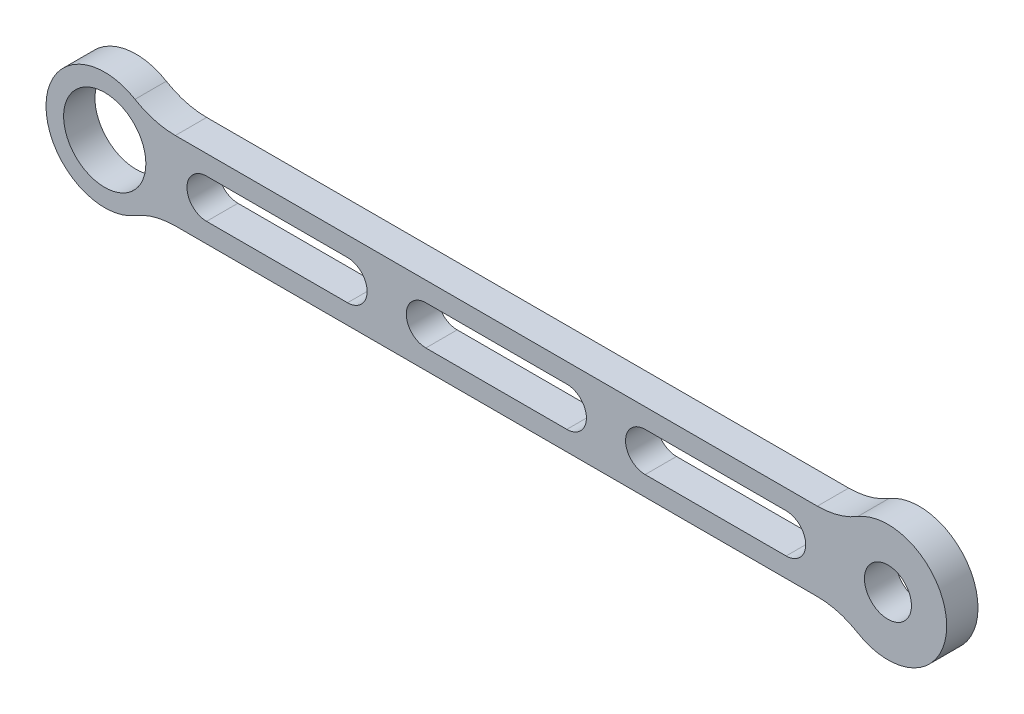
ISO-10303-21;
HEADER;
FILE_DESCRIPTION(('STEP AP214'),'2;1');
FILE_NAME('part.step','',(''),(''),'','','');
FILE_SCHEMA(('AUTOMOTIVE_DESIGN { 1 0 10303 214 1 1 1 1 }'));
ENDSEC;
DATA;
#1=APPLICATION_CONTEXT('core data for automotive mechanical design processes');
#2=APPLICATION_PROTOCOL_DEFINITION('international standard','automotive_design',2000,#1);
#3=PRODUCT_CONTEXT('',#1,'mechanical');
#4=PRODUCT('Part','Part','',(#3));
#5=PRODUCT_RELATED_PRODUCT_CATEGORY('part','',(#4));
#6=PRODUCT_DEFINITION_FORMATION('','',#4);
#7=PRODUCT_DEFINITION_CONTEXT('part definition',#1,'design');
#8=PRODUCT_DEFINITION('design','',#6,#7);
#9=PRODUCT_DEFINITION_SHAPE('','',#8);
#10=(LENGTH_UNIT() NAMED_UNIT(*) SI_UNIT(.MILLI.,.METRE.));
#11=(NAMED_UNIT(*) PLANE_ANGLE_UNIT() SI_UNIT($,.RADIAN.));
#12=(NAMED_UNIT(*) SI_UNIT($,.STERADIAN.) SOLID_ANGLE_UNIT());
#13=UNCERTAINTY_MEASURE_WITH_UNIT(LENGTH_MEASURE(1.E-05),#10,'distance_accuracy_value','');
#14=(GEOMETRIC_REPRESENTATION_CONTEXT(3) GLOBAL_UNCERTAINTY_ASSIGNED_CONTEXT((#13)) GLOBAL_UNIT_ASSIGNED_CONTEXT((#10,
#11,#12)) REPRESENTATION_CONTEXT('',''));
#15=CARTESIAN_POINT('',(0.,0.,0.));
#16=DIRECTION('',(0.,0.,1.));
#17=DIRECTION('',(1.,0.,0.));
#18=AXIS2_PLACEMENT_3D('',#15,#16,#17);
#19=CARTESIAN_POINT('',(0.,0.,8.));
#20=DIRECTION('',(0.,0.,-1.));
#21=DIRECTION('',(-1.,0.,0.));
#22=AXIS2_PLACEMENT_3D('',#19,#20,#21);
#23=CYLINDRICAL_SURFACE('',#22,15.);
#24=CARTESIAN_POINT('',(0.,0.,0.));
#25=DIRECTION('',(0.,0.,1.));
#26=DIRECTION('',(1.,0.,0.));
#27=AXIS2_PLACEMENT_3D('',#24,#25,#26);
#28=CIRCLE('',#27,15.);
#29=CARTESIAN_POINT('',(7.72618130456569,12.8571428571429,0.));
#30=VERTEX_POINT('',#29);
#31=CARTESIAN_POINT('',(7.72618130456569,-12.8571428571429,0.));
#32=VERTEX_POINT('',#31);
#33=EDGE_CURVE('E265',#30,#32,#28,.T.);
#34=ORIENTED_EDGE('',*,*,#33,.T.);
#35=DIRECTION('',(0.,0.,-1.));
#36=VECTOR('',#35,1.);
#37=CARTESIAN_POINT('',(7.7261813045657,-12.8571428571429,8.));
#38=LINE('',#37,#36);
#39=CARTESIAN_POINT('',(7.72618130456569,-12.8571428571429,8.));
#40=VERTEX_POINT('',#39);
#41=EDGE_CURVE('E294',#32,#40,#38,.F.);
#42=ORIENTED_EDGE('',*,*,#41,.T.);
#43=CARTESIAN_POINT('',(0.,0.,8.));
#44=DIRECTION('',(0.,0.,1.));
#45=DIRECTION('',(1.,0.,0.));
#46=AXIS2_PLACEMENT_3D('',#43,#44,#45);
#47=CIRCLE('',#46,15.);
#48=CARTESIAN_POINT('',(7.72618130456569,12.8571428571429,8.));
#49=VERTEX_POINT('',#48);
#50=EDGE_CURVE('E251',#49,#40,#47,.T.);
#51=ORIENTED_EDGE('',*,*,#50,.F.);
#52=DIRECTION('',(0.,0.,-1.));
#53=VECTOR('',#52,1.);
#54=CARTESIAN_POINT('',(7.7261813045657,12.8571428571429,8.));
#55=LINE('',#54,#53);
#56=EDGE_CURVE('E291',#49,#30,#55,.T.);
#57=ORIENTED_EDGE('',*,*,#56,.T.);
#58=EDGE_LOOP('',(#34,#42,#51,#57));
#59=FACE_BOUND('',#58,.T.);
#60=ADVANCED_FACE('F36',(#59),#23,.T.);
#61=CARTESIAN_POINT('',(0.,-10.,8.));
#62=DIRECTION('',(0.,1.,0.));
#63=DIRECTION('',(0.,0.,1.));
#64=AXIS2_PLACEMENT_3D('',#61,#62,#63);
#65=PLANE('',#64);
#66=DIRECTION('',(1.,0.,0.));
#67=VECTOR('',#66,1.);
#68=CARTESIAN_POINT('',(0.,-10.,0.));
#69=LINE('',#68,#67);
#70=CARTESIAN_POINT('',(18.02775637732,-10.,0.));
#71=VERTEX_POINT('',#70);
#72=CARTESIAN_POINT('',(181.97224362268,-10.,0.));
#73=VERTEX_POINT('',#72);
#74=EDGE_CURVE('E268',#71,#73,#69,.T.);
#75=ORIENTED_EDGE('',*,*,#74,.T.);
#76=DIRECTION('',(0.,0.,1.));
#77=VECTOR('',#76,1.);
#78=CARTESIAN_POINT('',(181.97224362268,-10.,8.));
#79=LINE('',#78,#77);
#80=CARTESIAN_POINT('',(181.97224362268,-10.,8.));
#81=VERTEX_POINT('',#80);
#82=EDGE_CURVE('E289',#73,#81,#79,.T.);
#83=ORIENTED_EDGE('',*,*,#82,.T.);
#84=DIRECTION('',(1.,0.,0.));
#85=VECTOR('',#84,1.);
#86=CARTESIAN_POINT('',(0.,-10.,8.));
#87=LINE('',#86,#85);
#88=CARTESIAN_POINT('',(18.02775637732,-10.,8.));
#89=VERTEX_POINT('',#88);
#90=EDGE_CURVE('E254',#89,#81,#87,.T.);
#91=ORIENTED_EDGE('',*,*,#90,.F.);
#92=DIRECTION('',(0.,0.,1.));
#93=VECTOR('',#92,1.);
#94=CARTESIAN_POINT('',(18.02775637732,-10.,0.));
#95=LINE('',#94,#93);
#96=EDGE_CURVE('E286',#89,#71,#95,.F.);
#97=ORIENTED_EDGE('',*,*,#96,.T.);
#98=EDGE_LOOP('',(#75,#83,#91,#97));
#99=FACE_BOUND('',#98,.T.);
#100=ADVANCED_FACE('F362',(#99),#65,.F.);
#101=CARTESIAN_POINT('',(200.,0.,8.));
#102=DIRECTION('',(0.,0.,-1.));
#103=DIRECTION('',(-1.,0.,0.));
#104=AXIS2_PLACEMENT_3D('',#101,#102,#103);
#105=CYLINDRICAL_SURFACE('',#104,15.);
#106=CARTESIAN_POINT('',(200.,0.,0.));
#107=DIRECTION('',(0.,0.,1.));
#108=DIRECTION('',(1.,0.,0.));
#109=AXIS2_PLACEMENT_3D('',#106,#107,#108);
#110=CIRCLE('',#109,15.);
#111=CARTESIAN_POINT('',(192.273818695434,-12.8571428571429,0.));
#112=VERTEX_POINT('',#111);
#113=CARTESIAN_POINT('',(192.273818695434,12.8571428571429,0.));
#114=VERTEX_POINT('',#113);
#115=EDGE_CURVE('E272',#112,#114,#110,.T.);
#116=ORIENTED_EDGE('',*,*,#115,.T.);
#117=DIRECTION('',(0.,0.,-1.));
#118=VECTOR('',#117,1.);
#119=CARTESIAN_POINT('',(192.273818695434,12.8571428571429,8.));
#120=LINE('',#119,#118);
#121=CARTESIAN_POINT('',(192.273818695434,12.8571428571429,8.));
#122=VERTEX_POINT('',#121);
#123=EDGE_CURVE('E284',#114,#122,#120,.F.);
#124=ORIENTED_EDGE('',*,*,#123,.T.);
#125=CARTESIAN_POINT('',(200.,0.,8.));
#126=DIRECTION('',(0.,0.,1.));
#127=DIRECTION('',(1.,0.,0.));
#128=AXIS2_PLACEMENT_3D('',#125,#126,#127);
#129=CIRCLE('',#128,15.);
#130=CARTESIAN_POINT('',(192.273818695434,-12.8571428571429,8.));
#131=VERTEX_POINT('',#130);
#132=EDGE_CURVE('E258',#131,#122,#129,.T.);
#133=ORIENTED_EDGE('',*,*,#132,.F.);
#134=DIRECTION('',(0.,0.,-1.));
#135=VECTOR('',#134,1.);
#136=CARTESIAN_POINT('',(192.273818695434,-12.8571428571429,8.));
#137=LINE('',#136,#135);
#138=EDGE_CURVE('E281',#131,#112,#137,.T.);
#139=ORIENTED_EDGE('',*,*,#138,.T.);
#140=EDGE_LOOP('',(#116,#124,#133,#139));
#141=FACE_BOUND('',#140,.T.);
#142=ADVANCED_FACE('F368',(#141),#105,.T.);
#143=CARTESIAN_POINT('',(0.,10.,8.));
#144=DIRECTION('',(0.,1.,0.));
#145=DIRECTION('',(0.,0.,1.));
#146=AXIS2_PLACEMENT_3D('',#143,#144,#145);
#147=PLANE('',#146);
#148=DIRECTION('',(1.,0.,0.));
#149=VECTOR('',#148,1.);
#150=CARTESIAN_POINT('',(0.,10.,8.));
#151=LINE('',#150,#149);
#152=CARTESIAN_POINT('',(18.02775637732,10.,8.));
#153=VERTEX_POINT('',#152);
#154=CARTESIAN_POINT('',(181.97224362268,10.,8.));
#155=VERTEX_POINT('',#154);
#156=EDGE_CURVE('E261',#153,#155,#151,.T.);
#157=ORIENTED_EDGE('',*,*,#156,.T.);
#158=DIRECTION('',(0.,0.,-1.));
#159=VECTOR('',#158,1.);
#160=CARTESIAN_POINT('',(181.97224362268,10.,8.));
#161=LINE('',#160,#159);
#162=CARTESIAN_POINT('',(181.97224362268,10.,0.));
#163=VERTEX_POINT('',#162);
#164=EDGE_CURVE('E278',#155,#163,#161,.T.);
#165=ORIENTED_EDGE('',*,*,#164,.T.);
#166=DIRECTION('',(1.,0.,0.));
#167=VECTOR('',#166,1.);
#168=CARTESIAN_POINT('',(0.,10.,0.));
#169=LINE('',#168,#167);
#170=CARTESIAN_POINT('',(18.02775637732,10.,0.));
#171=VERTEX_POINT('',#170);
#172=EDGE_CURVE('E255',#171,#163,#169,.T.);
#173=ORIENTED_EDGE('',*,*,#172,.F.);
#174=DIRECTION('',(0.,0.,-1.));
#175=VECTOR('',#174,1.);
#176=CARTESIAN_POINT('',(18.02775637732,10.,8.));
#177=LINE('',#176,#175);
#178=EDGE_CURVE('E264',#171,#153,#177,.F.);
#179=ORIENTED_EDGE('',*,*,#178,.T.);
#180=EDGE_LOOP('',(#157,#165,#173,#179));
#181=FACE_BOUND('',#180,.T.);
#182=ADVANCED_FACE('F407',(#181),#147,.T.);
#183=CARTESIAN_POINT('',(0.,0.,8.));
#184=DIRECTION('',(0.,0.,1.));
#185=DIRECTION('',(1.,0.,0.));
#186=AXIS2_PLACEMENT_3D('',#183,#184,#185);
#187=PLANE('',#186);
#188=DIRECTION('',(1.,0.,0.));
#189=VECTOR('',#188,1.);
#190=CARTESIAN_POINT('',(0.,-5.00000000000039,8.));
#191=LINE('',#190,#189);
#192=CARTESIAN_POINT('',(26.,-5.00000000000039,8.));
#193=VERTEX_POINT('',#192);
#194=CARTESIAN_POINT('',(62.,-5.0000000000004,8.));
#195=VERTEX_POINT('',#194);
#196=EDGE_CURVE('E51',#193,#195,#191,.T.);
#197=ORIENTED_EDGE('',*,*,#196,.F.);
#198=CARTESIAN_POINT('',(26.,-3.87576462998477E-13,8.));
#199=DIRECTION('',(0.,0.,1.));
#200=DIRECTION('',(1.,0.,0.));
#201=AXIS2_PLACEMENT_3D('',#198,#199,#200);
#202=CIRCLE('',#201,5.);
#203=CARTESIAN_POINT('',(26.,4.99999999999961,8.));
#204=VERTEX_POINT('',#203);
#205=EDGE_CURVE('E197',#204,#193,#202,.T.);
#206=ORIENTED_EDGE('',*,*,#205,.F.);
#207=DIRECTION('',(1.,0.,0.));
#208=VECTOR('',#207,1.);
#209=CARTESIAN_POINT('',(0.,4.99999999999962,8.));
#210=LINE('',#209,#208);
#211=CARTESIAN_POINT('',(62.,4.99999999999961,8.));
#212=VERTEX_POINT('',#211);
#213=EDGE_CURVE('E180',#204,#212,#210,.T.);
#214=ORIENTED_EDGE('',*,*,#213,.T.);
#215=CARTESIAN_POINT('',(62.,-3.85841739522501E-13,8.));
#216=DIRECTION('',(0.,0.,1.));
#217=DIRECTION('',(1.,0.,0.));
#218=AXIS2_PLACEMENT_3D('',#215,#216,#217);
#219=CIRCLE('',#218,5.00000000000001);
#220=EDGE_CURVE('E190',#195,#212,#219,.T.);
#221=ORIENTED_EDGE('',*,*,#220,.F.);
#222=EDGE_LOOP('',(#197,#206,#214,#221));
#223=FACE_BOUND('',#222,.T.);
#224=CARTESIAN_POINT('',(82.,0.,8.));
#225=DIRECTION('',(0.,0.,1.));
#226=DIRECTION('',(1.,0.,0.));
#227=AXIS2_PLACEMENT_3D('',#224,#225,#226);
#228=CIRCLE('',#227,5.);
#229=CARTESIAN_POINT('',(82.,5.,8.));
#230=VERTEX_POINT('',#229);
#231=CARTESIAN_POINT('',(82.,-5.,8.));
#232=VERTEX_POINT('',#231);
#233=EDGE_CURVE('E59',#230,#232,#228,.T.);
#234=ORIENTED_EDGE('',*,*,#233,.F.);
#235=DIRECTION('',(1.,0.,0.));
#236=VECTOR('',#235,1.);
#237=CARTESIAN_POINT('',(0.,5.00000000000001,8.));
#238=LINE('',#237,#236);
#239=CARTESIAN_POINT('',(118.,5.,8.));
#240=VERTEX_POINT('',#239);
#241=EDGE_CURVE('E215',#230,#240,#238,.T.);
#242=ORIENTED_EDGE('',*,*,#241,.T.);
#243=CARTESIAN_POINT('',(118.,0.,8.));
#244=DIRECTION('',(0.,0.,1.));
#245=DIRECTION('',(1.,0.,0.));
#246=AXIS2_PLACEMENT_3D('',#243,#244,#245);
#247=CIRCLE('',#246,5.);
#248=CARTESIAN_POINT('',(118.,-4.99999999999999,8.));
#249=VERTEX_POINT('',#248);
#250=EDGE_CURVE('E212',#249,#240,#247,.T.);
#251=ORIENTED_EDGE('',*,*,#250,.F.);
#252=DIRECTION('',(1.,0.,0.));
#253=VECTOR('',#252,1.);
#254=CARTESIAN_POINT('',(0.,-5.00000000000001,8.));
#255=LINE('',#254,#253);
#256=EDGE_CURVE('E208',#232,#249,#255,.T.);
#257=ORIENTED_EDGE('',*,*,#256,.F.);
#258=EDGE_LOOP('',(#234,#242,#251,#257));
#259=FACE_BOUND('',#258,.T.);
#260=CARTESIAN_POINT('',(138.,0.,8.));
#261=DIRECTION('',(0.,0.,1.));
#262=DIRECTION('',(1.,0.,0.));
#263=AXIS2_PLACEMENT_3D('',#260,#261,#262);
#264=CIRCLE('',#263,4.99999999999999);
#265=CARTESIAN_POINT('',(138.,5.,8.));
#266=VERTEX_POINT('',#265);
#267=CARTESIAN_POINT('',(138.,-5.,8.));
#268=VERTEX_POINT('',#267);
#269=EDGE_CURVE('E226',#266,#268,#264,.T.);
#270=ORIENTED_EDGE('',*,*,#269,.F.);
#271=DIRECTION('',(1.,0.,0.));
#272=VECTOR('',#271,1.);
#273=CARTESIAN_POINT('',(0.,5.00000000000002,8.));
#274=LINE('',#273,#272);
#275=CARTESIAN_POINT('',(174.,5.,8.));
#276=VERTEX_POINT('',#275);
#277=EDGE_CURVE('E234',#266,#276,#274,.T.);
#278=ORIENTED_EDGE('',*,*,#277,.T.);
#279=CARTESIAN_POINT('',(174.,0.,8.));
#280=DIRECTION('',(0.,0.,1.));
#281=DIRECTION('',(1.,0.,0.));
#282=AXIS2_PLACEMENT_3D('',#279,#280,#281);
#283=CIRCLE('',#282,4.99999999999999);
#284=CARTESIAN_POINT('',(174.,-4.99999999999999,8.));
#285=VERTEX_POINT('',#284);
#286=EDGE_CURVE('E231',#285,#276,#283,.T.);
#287=ORIENTED_EDGE('',*,*,#286,.F.);
#288=DIRECTION('',(1.,0.,0.));
#289=VECTOR('',#288,1.);
#290=CARTESIAN_POINT('',(0.,-5.00000000000002,8.));
#291=LINE('',#290,#289);
#292=EDGE_CURVE('E228',#268,#285,#291,.T.);
#293=ORIENTED_EDGE('',*,*,#292,.F.);
#294=EDGE_LOOP('',(#270,#278,#287,#293));
#295=FACE_BOUND('',#294,.T.);
#296=CARTESIAN_POINT('',(0.,0.,8.));
#297=DIRECTION('',(0.,0.,1.));
#298=DIRECTION('',(1.,0.,0.));
#299=AXIS2_PLACEMENT_3D('',#296,#297,#298);
#300=CIRCLE('',#299,10.5);
#301=CARTESIAN_POINT('',(10.5,0.,8.));
#302=VERTEX_POINT('',#301);
#303=EDGE_CURVE('E245',#302,#302,#300,.T.);
#304=ORIENTED_EDGE('',*,*,#303,.F.);
#305=EDGE_LOOP('',(#304));
#306=FACE_BOUND('',#305,.T.);
#307=CARTESIAN_POINT('',(200.,0.,8.));
#308=DIRECTION('',(0.,0.,1.));
#309=DIRECTION('',(1.,0.,0.));
#310=AXIS2_PLACEMENT_3D('',#307,#308,#309);
#311=CIRCLE('',#310,6.00000000000002);
#312=CARTESIAN_POINT('',(206.,0.,8.));
#313=VERTEX_POINT('',#312);
#314=EDGE_CURVE('E204',#313,#313,#311,.T.);
#315=ORIENTED_EDGE('',*,*,#314,.F.);
#316=EDGE_LOOP('',(#315));
#317=FACE_BOUND('',#316,.T.);
#318=ORIENTED_EDGE('',*,*,#156,.F.);
#319=CARTESIAN_POINT('',(18.02775637732,30.,8.));
#320=DIRECTION('',(0.,0.,1.));
#321=DIRECTION('',(1.,0.,0.));
#322=AXIS2_PLACEMENT_3D('',#319,#320,#321);
#323=CIRCLE('',#322,20.);
#324=EDGE_CURVE('E310',#153,#49,#323,.F.);
#325=ORIENTED_EDGE('',*,*,#324,.T.);
#326=ORIENTED_EDGE('',*,*,#50,.T.);
#327=CARTESIAN_POINT('',(18.02775637732,-30.,8.));
#328=DIRECTION('',(0.,0.,1.));
#329=DIRECTION('',(1.,0.,0.));
#330=AXIS2_PLACEMENT_3D('',#327,#328,#329);
#331=CIRCLE('',#330,20.);
#332=EDGE_CURVE('E306',#40,#89,#331,.F.);
#333=ORIENTED_EDGE('',*,*,#332,.T.);
#334=ORIENTED_EDGE('',*,*,#90,.T.);
#335=CARTESIAN_POINT('',(181.97224362268,-30.,8.));
#336=DIRECTION('',(0.,0.,1.));
#337=DIRECTION('',(1.,0.,0.));
#338=AXIS2_PLACEMENT_3D('',#335,#336,#337);
#339=CIRCLE('',#338,20.);
#340=EDGE_CURVE('E302',#81,#131,#339,.F.);
#341=ORIENTED_EDGE('',*,*,#340,.T.);
#342=ORIENTED_EDGE('',*,*,#132,.T.);
#343=CARTESIAN_POINT('',(181.97224362268,30.,8.));
#344=DIRECTION('',(0.,0.,1.));
#345=DIRECTION('',(1.,0.,0.));
#346=AXIS2_PLACEMENT_3D('',#343,#344,#345);
#347=CIRCLE('',#346,20.);
#348=EDGE_CURVE('E298',#122,#155,#347,.F.);
#349=ORIENTED_EDGE('',*,*,#348,.T.);
#350=EDGE_LOOP('',(#318,#325,#326,#333,#334,#341,#342,#349));
#351=FACE_BOUND('',#350,.T.);
#352=ADVANCED_FACE('F194',(#223,#259,#295,#306,#317,#351),#187,.T.);
#353=CARTESIAN_POINT('',(0.,0.,0.));
#354=DIRECTION('',(0.,0.,1.));
#355=DIRECTION('',(1.,0.,0.));
#356=AXIS2_PLACEMENT_3D('',#353,#354,#355);
#357=PLANE('',#356);
#358=CARTESIAN_POINT('',(26.,-3.87576462998477E-13,0.));
#359=DIRECTION('',(0.,0.,1.));
#360=DIRECTION('',(1.,0.,0.));
#361=AXIS2_PLACEMENT_3D('',#358,#359,#360);
#362=CIRCLE('',#361,5.);
#363=CARTESIAN_POINT('',(26.,4.99999999999961,0.));
#364=VERTEX_POINT('',#363);
#365=CARTESIAN_POINT('',(26.,-5.00000000000039,0.));
#366=VERTEX_POINT('',#365);
#367=EDGE_CURVE('E44',#364,#366,#362,.T.);
#368=ORIENTED_EDGE('',*,*,#367,.T.);
#369=DIRECTION('',(1.,0.,0.));
#370=VECTOR('',#369,1.);
#371=CARTESIAN_POINT('',(0.,-5.00000000000039,0.));
#372=LINE('',#371,#370);
#373=CARTESIAN_POINT('',(62.,-5.00000000000038,0.));
#374=VERTEX_POINT('',#373);
#375=EDGE_CURVE('E11',#366,#374,#372,.T.);
#376=ORIENTED_EDGE('',*,*,#375,.T.);
#377=CARTESIAN_POINT('',(62.,-3.85841739522501E-13,0.));
#378=DIRECTION('',(0.,0.,1.));
#379=DIRECTION('',(1.,0.,0.));
#380=AXIS2_PLACEMENT_3D('',#377,#378,#379);
#381=CIRCLE('',#380,5.00000000000001);
#382=CARTESIAN_POINT('',(62.,4.99999999999962,0.));
#383=VERTEX_POINT('',#382);
#384=EDGE_CURVE('E338',#374,#383,#381,.T.);
#385=ORIENTED_EDGE('',*,*,#384,.T.);
#386=DIRECTION('',(1.,0.,0.));
#387=VECTOR('',#386,1.);
#388=CARTESIAN_POINT('',(0.,4.99999999999962,0.));
#389=LINE('',#388,#387);
#390=EDGE_CURVE('E183',#364,#383,#389,.T.);
#391=ORIENTED_EDGE('',*,*,#390,.F.);
#392=EDGE_LOOP('',(#368,#376,#385,#391));
#393=FACE_BOUND('',#392,.T.);
#394=DIRECTION('',(1.,0.,0.));
#395=VECTOR('',#394,1.);
#396=CARTESIAN_POINT('',(0.,5.00000000000001,0.));
#397=LINE('',#396,#395);
#398=CARTESIAN_POINT('',(82.,5.,0.));
#399=VERTEX_POINT('',#398);
#400=CARTESIAN_POINT('',(118.,5.,0.));
#401=VERTEX_POINT('',#400);
#402=EDGE_CURVE('E333',#399,#401,#397,.T.);
#403=ORIENTED_EDGE('',*,*,#402,.F.);
#404=CARTESIAN_POINT('',(82.,0.,0.));
#405=DIRECTION('',(0.,0.,1.));
#406=DIRECTION('',(1.,0.,0.));
#407=AXIS2_PLACEMENT_3D('',#404,#405,#406);
#408=CIRCLE('',#407,5.);
#409=CARTESIAN_POINT('',(82.,-5.,0.));
#410=VERTEX_POINT('',#409);
#411=EDGE_CURVE('E335',#399,#410,#408,.T.);
#412=ORIENTED_EDGE('',*,*,#411,.T.);
#413=DIRECTION('',(1.,0.,0.));
#414=VECTOR('',#413,1.);
#415=CARTESIAN_POINT('',(0.,-5.00000000000001,0.));
#416=LINE('',#415,#414);
#417=CARTESIAN_POINT('',(118.,-4.99999999999999,0.));
#418=VERTEX_POINT('',#417);
#419=EDGE_CURVE('E327',#410,#418,#416,.T.);
#420=ORIENTED_EDGE('',*,*,#419,.T.);
#421=CARTESIAN_POINT('',(118.,0.,0.));
#422=DIRECTION('',(0.,0.,1.));
#423=DIRECTION('',(1.,0.,0.));
#424=AXIS2_PLACEMENT_3D('',#421,#422,#423);
#425=CIRCLE('',#424,5.);
#426=EDGE_CURVE('E330',#418,#401,#425,.T.);
#427=ORIENTED_EDGE('',*,*,#426,.T.);
#428=EDGE_LOOP('',(#403,#412,#420,#427));
#429=FACE_BOUND('',#428,.T.);
#430=DIRECTION('',(1.,0.,0.));
#431=VECTOR('',#430,1.);
#432=CARTESIAN_POINT('',(0.,5.00000000000002,0.));
#433=LINE('',#432,#431);
#434=CARTESIAN_POINT('',(138.,5.,0.));
#435=VERTEX_POINT('',#434);
#436=CARTESIAN_POINT('',(174.,5.,0.));
#437=VERTEX_POINT('',#436);
#438=EDGE_CURVE('E322',#435,#437,#433,.T.);
#439=ORIENTED_EDGE('',*,*,#438,.F.);
#440=CARTESIAN_POINT('',(138.,0.,0.));
#441=DIRECTION('',(0.,0.,1.));
#442=DIRECTION('',(1.,0.,0.));
#443=AXIS2_PLACEMENT_3D('',#440,#441,#442);
#444=CIRCLE('',#443,4.99999999999999);
#445=CARTESIAN_POINT('',(138.,-5.,0.));
#446=VERTEX_POINT('',#445);
#447=EDGE_CURVE('E324',#435,#446,#444,.T.);
#448=ORIENTED_EDGE('',*,*,#447,.T.);
#449=DIRECTION('',(1.,0.,0.));
#450=VECTOR('',#449,1.);
#451=CARTESIAN_POINT('',(0.,-5.00000000000002,0.));
#452=LINE('',#451,#450);
#453=CARTESIAN_POINT('',(174.,-4.99999999999999,0.));
#454=VERTEX_POINT('',#453);
#455=EDGE_CURVE('E312',#446,#454,#452,.T.);
#456=ORIENTED_EDGE('',*,*,#455,.T.);
#457=CARTESIAN_POINT('',(174.,0.,0.));
#458=DIRECTION('',(0.,0.,1.));
#459=DIRECTION('',(1.,0.,0.));
#460=AXIS2_PLACEMENT_3D('',#457,#458,#459);
#461=CIRCLE('',#460,4.99999999999999);
#462=EDGE_CURVE('E319',#454,#437,#461,.T.);
#463=ORIENTED_EDGE('',*,*,#462,.T.);
#464=EDGE_LOOP('',(#439,#448,#456,#463));
#465=FACE_BOUND('',#464,.T.);
#466=CARTESIAN_POINT('',(0.,0.,0.));
#467=DIRECTION('',(0.,0.,1.));
#468=DIRECTION('',(1.,0.,0.));
#469=AXIS2_PLACEMENT_3D('',#466,#467,#468);
#470=CIRCLE('',#469,10.5);
#471=CARTESIAN_POINT('',(10.5,0.,0.));
#472=VERTEX_POINT('',#471);
#473=EDGE_CURVE('E269',#472,#472,#470,.T.);
#474=ORIENTED_EDGE('',*,*,#473,.T.);
#475=EDGE_LOOP('',(#474));
#476=FACE_BOUND('',#475,.T.);
#477=CARTESIAN_POINT('',(200.,0.,0.));
#478=DIRECTION('',(0.,0.,1.));
#479=DIRECTION('',(1.,0.,0.));
#480=AXIS2_PLACEMENT_3D('',#477,#478,#479);
#481=CIRCLE('',#480,6.00000000000002);
#482=CARTESIAN_POINT('',(206.,0.,0.));
#483=VERTEX_POINT('',#482);
#484=EDGE_CURVE('E248',#483,#483,#481,.T.);
#485=ORIENTED_EDGE('',*,*,#484,.T.);
#486=EDGE_LOOP('',(#485));
#487=FACE_BOUND('',#486,.T.);
#488=ORIENTED_EDGE('',*,*,#33,.F.);
#489=CARTESIAN_POINT('',(18.02775637732,30.,0.));
#490=DIRECTION('',(0.,0.,1.));
#491=DIRECTION('',(1.,0.,0.));
#492=AXIS2_PLACEMENT_3D('',#489,#490,#491);
#493=CIRCLE('',#492,20.);
#494=EDGE_CURVE('E308',#30,#171,#493,.T.);
#495=ORIENTED_EDGE('',*,*,#494,.T.);
#496=ORIENTED_EDGE('',*,*,#172,.T.);
#497=CARTESIAN_POINT('',(181.97224362268,30.,0.));
#498=DIRECTION('',(0.,0.,1.));
#499=DIRECTION('',(1.,0.,0.));
#500=AXIS2_PLACEMENT_3D('',#497,#498,#499);
#501=CIRCLE('',#500,20.);
#502=EDGE_CURVE('E296',#163,#114,#501,.T.);
#503=ORIENTED_EDGE('',*,*,#502,.T.);
#504=ORIENTED_EDGE('',*,*,#115,.F.);
#505=CARTESIAN_POINT('',(181.97224362268,-30.,0.));
#506=DIRECTION('',(0.,0.,1.));
#507=DIRECTION('',(1.,0.,0.));
#508=AXIS2_PLACEMENT_3D('',#505,#506,#507);
#509=CIRCLE('',#508,20.);
#510=EDGE_CURVE('E300',#112,#73,#509,.T.);
#511=ORIENTED_EDGE('',*,*,#510,.T.);
#512=ORIENTED_EDGE('',*,*,#74,.F.);
#513=CARTESIAN_POINT('',(18.02775637732,-30.,0.));
#514=DIRECTION('',(0.,0.,1.));
#515=DIRECTION('',(1.,0.,0.));
#516=AXIS2_PLACEMENT_3D('',#513,#514,#515);
#517=CIRCLE('',#516,20.);
#518=EDGE_CURVE('E304',#71,#32,#517,.T.);
#519=ORIENTED_EDGE('',*,*,#518,.T.);
#520=EDGE_LOOP('',(#488,#495,#496,#503,#504,#511,#512,#519));
#521=FACE_BOUND('',#520,.T.);
#522=ADVANCED_FACE('F342',(#393,#429,#465,#476,#487,#521),#357,.F.);
#523=CARTESIAN_POINT('',(181.97224362268,30.,8.));
#524=DIRECTION('',(0.,0.,-1.));
#525=DIRECTION('',(-1.,0.,0.));
#526=AXIS2_PLACEMENT_3D('',#523,#524,#525);
#527=CYLINDRICAL_SURFACE('',#526,20.);
#528=ORIENTED_EDGE('',*,*,#348,.F.);
#529=ORIENTED_EDGE('',*,*,#123,.F.);
#530=ORIENTED_EDGE('',*,*,#502,.F.);
#531=ORIENTED_EDGE('',*,*,#164,.F.);
#532=EDGE_LOOP('',(#528,#529,#530,#531));
#533=FACE_BOUND('',#532,.T.);
#534=ADVANCED_FACE('F373',(#533),#527,.F.);
#535=CARTESIAN_POINT('',(181.97224362268,-30.,8.));
#536=DIRECTION('',(0.,0.,-1.));
#537=DIRECTION('',(-1.,0.,0.));
#538=AXIS2_PLACEMENT_3D('',#535,#536,#537);
#539=CYLINDRICAL_SURFACE('',#538,20.);
#540=ORIENTED_EDGE('',*,*,#340,.F.);
#541=ORIENTED_EDGE('',*,*,#82,.F.);
#542=ORIENTED_EDGE('',*,*,#510,.F.);
#543=ORIENTED_EDGE('',*,*,#138,.F.);
#544=EDGE_LOOP('',(#540,#541,#542,#543));
#545=FACE_BOUND('',#544,.T.);
#546=ADVANCED_FACE('F376',(#545),#539,.F.);
#547=CARTESIAN_POINT('',(18.02775637732,-30.,8.));
#548=DIRECTION('',(0.,0.,-1.));
#549=DIRECTION('',(-1.,0.,0.));
#550=AXIS2_PLACEMENT_3D('',#547,#548,#549);
#551=CYLINDRICAL_SURFACE('',#550,20.);
#552=ORIENTED_EDGE('',*,*,#332,.F.);
#553=ORIENTED_EDGE('',*,*,#41,.F.);
#554=ORIENTED_EDGE('',*,*,#518,.F.);
#555=ORIENTED_EDGE('',*,*,#96,.F.);
#556=EDGE_LOOP('',(#552,#553,#554,#555));
#557=FACE_BOUND('',#556,.T.);
#558=ADVANCED_FACE('F379',(#557),#551,.F.);
#559=CARTESIAN_POINT('',(18.02775637732,30.,8.));
#560=DIRECTION('',(0.,0.,-1.));
#561=DIRECTION('',(-1.,0.,0.));
#562=AXIS2_PLACEMENT_3D('',#559,#560,#561);
#563=CYLINDRICAL_SURFACE('',#562,20.);
#564=ORIENTED_EDGE('',*,*,#324,.F.);
#565=ORIENTED_EDGE('',*,*,#178,.F.);
#566=ORIENTED_EDGE('',*,*,#494,.F.);
#567=ORIENTED_EDGE('',*,*,#56,.F.);
#568=EDGE_LOOP('',(#564,#565,#566,#567));
#569=FACE_BOUND('',#568,.T.);
#570=ADVANCED_FACE('F38',(#569),#563,.F.);
#571=CARTESIAN_POINT('',(200.,0.,-2.));
#572=DIRECTION('',(0.,0.,1.));
#573=DIRECTION('',(1.,0.,0.));
#574=AXIS2_PLACEMENT_3D('',#571,#572,#573);
#575=CYLINDRICAL_SURFACE('',#574,6.00000000000002);
#576=ORIENTED_EDGE('',*,*,#314,.T.);
#577=EDGE_LOOP('',(#576));
#578=FACE_BOUND('',#577,.T.);
#579=ORIENTED_EDGE('',*,*,#484,.F.);
#580=EDGE_LOOP('',(#579));
#581=FACE_BOUND('',#580,.T.);
#582=ADVANCED_FACE('F386',(#578,#581),#575,.F.);
#583=CARTESIAN_POINT('',(0.,0.,-2.));
#584=DIRECTION('',(0.,0.,1.));
#585=DIRECTION('',(1.,0.,0.));
#586=AXIS2_PLACEMENT_3D('',#583,#584,#585);
#587=CYLINDRICAL_SURFACE('',#586,10.5);
#588=ORIENTED_EDGE('',*,*,#303,.T.);
#589=EDGE_LOOP('',(#588));
#590=FACE_BOUND('',#589,.T.);
#591=ORIENTED_EDGE('',*,*,#473,.F.);
#592=EDGE_LOOP('',(#591));
#593=FACE_BOUND('',#592,.T.);
#594=ADVANCED_FACE('F443',(#590,#593),#587,.F.);
#595=CARTESIAN_POINT('',(138.,0.,-2.));
#596=DIRECTION('',(0.,0.,1.));
#597=DIRECTION('',(1.,0.,0.));
#598=AXIS2_PLACEMENT_3D('',#595,#596,#597);
#599=CYLINDRICAL_SURFACE('',#598,4.99999999999999);
#600=DIRECTION('',(0.,0.,1.));
#601=VECTOR('',#600,1.);
#602=CARTESIAN_POINT('',(138.,5.,-2.));
#603=LINE('',#602,#601);
#604=EDGE_CURVE('E209',#435,#266,#603,.T.);
#605=ORIENTED_EDGE('',*,*,#604,.T.);
#606=ORIENTED_EDGE('',*,*,#269,.T.);
#607=DIRECTION('',(0.,0.,1.));
#608=VECTOR('',#607,1.);
#609=CARTESIAN_POINT('',(138.,-5.,-2.));
#610=LINE('',#609,#608);
#611=EDGE_CURVE('E237',#446,#268,#610,.T.);
#612=ORIENTED_EDGE('',*,*,#611,.F.);
#613=ORIENTED_EDGE('',*,*,#447,.F.);
#614=EDGE_LOOP('',(#605,#606,#612,#613));
#615=FACE_BOUND('',#614,.T.);
#616=ADVANCED_FACE('F455',(#615),#599,.F.);
#617=CARTESIAN_POINT('',(0.,5.00000000000002,-2.));
#618=DIRECTION('',(0.,-1.,0.));
#619=DIRECTION('',(1.,0.,0.));
#620=AXIS2_PLACEMENT_3D('',#617,#618,#619);
#621=PLANE('',#620);
#622=ORIENTED_EDGE('',*,*,#438,.T.);
#623=DIRECTION('',(0.,0.,1.));
#624=VECTOR('',#623,1.);
#625=CARTESIAN_POINT('',(174.,5.,-2.));
#626=LINE('',#625,#624);
#627=EDGE_CURVE('E239',#437,#276,#626,.T.);
#628=ORIENTED_EDGE('',*,*,#627,.T.);
#629=ORIENTED_EDGE('',*,*,#277,.F.);
#630=ORIENTED_EDGE('',*,*,#604,.F.);
#631=EDGE_LOOP('',(#622,#628,#629,#630));
#632=FACE_BOUND('',#631,.T.);
#633=ADVANCED_FACE('F460',(#632),#621,.T.);
#634=CARTESIAN_POINT('',(174.,0.,-2.));
#635=DIRECTION('',(0.,0.,1.));
#636=DIRECTION('',(1.,0.,0.));
#637=AXIS2_PLACEMENT_3D('',#634,#635,#636);
#638=CYLINDRICAL_SURFACE('',#637,4.99999999999999);
#639=DIRECTION('',(0.,0.,1.));
#640=VECTOR('',#639,1.);
#641=CARTESIAN_POINT('',(174.,-4.99999999999999,-2.));
#642=LINE('',#641,#640);
#643=EDGE_CURVE('E241',#454,#285,#642,.T.);
#644=ORIENTED_EDGE('',*,*,#643,.T.);
#645=ORIENTED_EDGE('',*,*,#286,.T.);
#646=ORIENTED_EDGE('',*,*,#627,.F.);
#647=ORIENTED_EDGE('',*,*,#462,.F.);
#648=EDGE_LOOP('',(#644,#645,#646,#647));
#649=FACE_BOUND('',#648,.T.);
#650=ADVANCED_FACE('F470',(#649),#638,.F.);
#651=CARTESIAN_POINT('',(0.,-5.00000000000002,-2.));
#652=DIRECTION('',(0.,-1.,0.));
#653=DIRECTION('',(1.,0.,0.));
#654=AXIS2_PLACEMENT_3D('',#651,#652,#653);
#655=PLANE('',#654);
#656=ORIENTED_EDGE('',*,*,#611,.T.);
#657=ORIENTED_EDGE('',*,*,#292,.T.);
#658=ORIENTED_EDGE('',*,*,#643,.F.);
#659=ORIENTED_EDGE('',*,*,#455,.F.);
#660=EDGE_LOOP('',(#656,#657,#658,#659));
#661=FACE_BOUND('',#660,.T.);
#662=ADVANCED_FACE('F480',(#661),#655,.F.);
#663=CARTESIAN_POINT('',(82.,0.,-2.));
#664=DIRECTION('',(0.,0.,1.));
#665=DIRECTION('',(1.,0.,0.));
#666=AXIS2_PLACEMENT_3D('',#663,#664,#665);
#667=CYLINDRICAL_SURFACE('',#666,5.);
#668=DIRECTION('',(0.,0.,1.));
#669=VECTOR('',#668,1.);
#670=CARTESIAN_POINT('',(82.,5.,-2.));
#671=LINE('',#670,#669);
#672=EDGE_CURVE('E219',#399,#230,#671,.T.);
#673=ORIENTED_EDGE('',*,*,#672,.T.);
#674=ORIENTED_EDGE('',*,*,#233,.T.);
#675=DIRECTION('',(0.,0.,1.));
#676=VECTOR('',#675,1.);
#677=CARTESIAN_POINT('',(82.,-5.,-2.));
#678=LINE('',#677,#676);
#679=EDGE_CURVE('E218',#410,#232,#678,.T.);
#680=ORIENTED_EDGE('',*,*,#679,.F.);
#681=ORIENTED_EDGE('',*,*,#411,.F.);
#682=EDGE_LOOP('',(#673,#674,#680,#681));
#683=FACE_BOUND('',#682,.T.);
#684=ADVANCED_FACE('F490',(#683),#667,.F.);
#685=CARTESIAN_POINT('',(0.,5.00000000000001,-2.));
#686=DIRECTION('',(0.,-1.,0.));
#687=DIRECTION('',(1.,0.,0.));
#688=AXIS2_PLACEMENT_3D('',#685,#686,#687);
#689=PLANE('',#688);
#690=ORIENTED_EDGE('',*,*,#402,.T.);
#691=DIRECTION('',(0.,0.,1.));
#692=VECTOR('',#691,1.);
#693=CARTESIAN_POINT('',(118.,5.,-2.));
#694=LINE('',#693,#692);
#695=EDGE_CURVE('E221',#401,#240,#694,.T.);
#696=ORIENTED_EDGE('',*,*,#695,.T.);
#697=ORIENTED_EDGE('',*,*,#241,.F.);
#698=ORIENTED_EDGE('',*,*,#672,.F.);
#699=EDGE_LOOP('',(#690,#696,#697,#698));
#700=FACE_BOUND('',#699,.T.);
#701=ADVANCED_FACE('F500',(#700),#689,.T.);
#702=CARTESIAN_POINT('',(118.,0.,-2.));
#703=DIRECTION('',(0.,0.,1.));
#704=DIRECTION('',(1.,0.,0.));
#705=AXIS2_PLACEMENT_3D('',#702,#703,#704);
#706=CYLINDRICAL_SURFACE('',#705,5.);
#707=DIRECTION('',(0.,0.,1.));
#708=VECTOR('',#707,1.);
#709=CARTESIAN_POINT('',(118.,-4.99999999999999,-2.));
#710=LINE('',#709,#708);
#711=EDGE_CURVE('E223',#418,#249,#710,.T.);
#712=ORIENTED_EDGE('',*,*,#711,.T.);
#713=ORIENTED_EDGE('',*,*,#250,.T.);
#714=ORIENTED_EDGE('',*,*,#695,.F.);
#715=ORIENTED_EDGE('',*,*,#426,.F.);
#716=EDGE_LOOP('',(#712,#713,#714,#715));
#717=FACE_BOUND('',#716,.T.);
#718=ADVANCED_FACE('F356',(#717),#706,.F.);
#719=CARTESIAN_POINT('',(0.,-5.00000000000001,-2.));
#720=DIRECTION('',(0.,-1.,0.));
#721=DIRECTION('',(1.,0.,0.));
#722=AXIS2_PLACEMENT_3D('',#719,#720,#721);
#723=PLANE('',#722);
#724=ORIENTED_EDGE('',*,*,#679,.T.);
#725=ORIENTED_EDGE('',*,*,#256,.T.);
#726=ORIENTED_EDGE('',*,*,#711,.F.);
#727=ORIENTED_EDGE('',*,*,#419,.F.);
#728=EDGE_LOOP('',(#724,#725,#726,#727));
#729=FACE_BOUND('',#728,.T.);
#730=ADVANCED_FACE('F349',(#729),#723,.F.);
#731=CARTESIAN_POINT('',(0.,-5.00000000000039,-2.));
#732=DIRECTION('',(0.,-1.,0.));
#733=DIRECTION('',(1.,0.,0.));
#734=AXIS2_PLACEMENT_3D('',#731,#732,#733);
#735=PLANE('',#734);
#736=DIRECTION('',(0.,0.,1.));
#737=VECTOR('',#736,1.);
#738=CARTESIAN_POINT('',(26.,-5.00000000000039,-2.));
#739=LINE('',#738,#737);
#740=EDGE_CURVE('E202',#366,#193,#739,.T.);
#741=ORIENTED_EDGE('',*,*,#740,.T.);
#742=ORIENTED_EDGE('',*,*,#196,.T.);
#743=DIRECTION('',(0.,0.,1.));
#744=VECTOR('',#743,1.);
#745=CARTESIAN_POINT('',(62.,-5.00000000000038,-2.));
#746=LINE('',#745,#744);
#747=EDGE_CURVE('E187',#374,#195,#746,.T.);
#748=ORIENTED_EDGE('',*,*,#747,.F.);
#749=ORIENTED_EDGE('',*,*,#375,.F.);
#750=EDGE_LOOP('',(#741,#742,#748,#749));
#751=FACE_BOUND('',#750,.T.);
#752=ADVANCED_FACE('F347',(#751),#735,.F.);
#753=CARTESIAN_POINT('',(26.,-3.87576462998477E-13,-2.));
#754=DIRECTION('',(0.,0.,1.));
#755=DIRECTION('',(1.,0.,0.));
#756=AXIS2_PLACEMENT_3D('',#753,#754,#755);
#757=CYLINDRICAL_SURFACE('',#756,5.);
#758=DIRECTION('',(0.,0.,1.));
#759=VECTOR('',#758,1.);
#760=CARTESIAN_POINT('',(26.,4.99999999999961,-2.));
#761=LINE('',#760,#759);
#762=EDGE_CURVE('E186',#364,#204,#761,.T.);
#763=ORIENTED_EDGE('',*,*,#762,.T.);
#764=ORIENTED_EDGE('',*,*,#205,.T.);
#765=ORIENTED_EDGE('',*,*,#740,.F.);
#766=ORIENTED_EDGE('',*,*,#367,.F.);
#767=EDGE_LOOP('',(#763,#764,#765,#766));
#768=FACE_BOUND('',#767,.T.);
#769=ADVANCED_FACE('F346',(#768),#757,.F.);
#770=CARTESIAN_POINT('',(0.,4.99999999999962,-2.));
#771=DIRECTION('',(0.,-1.,0.));
#772=DIRECTION('',(1.,0.,0.));
#773=AXIS2_PLACEMENT_3D('',#770,#771,#772);
#774=PLANE('',#773);
#775=ORIENTED_EDGE('',*,*,#390,.T.);
#776=DIRECTION('',(0.,0.,1.));
#777=VECTOR('',#776,1.);
#778=CARTESIAN_POINT('',(62.,4.99999999999961,-2.));
#779=LINE('',#778,#777);
#780=EDGE_CURVE('E175',#383,#212,#779,.T.);
#781=ORIENTED_EDGE('',*,*,#780,.T.);
#782=ORIENTED_EDGE('',*,*,#213,.F.);
#783=ORIENTED_EDGE('',*,*,#762,.F.);
#784=EDGE_LOOP('',(#775,#781,#782,#783));
#785=FACE_BOUND('',#784,.T.);
#786=ADVANCED_FACE('F177',(#785),#774,.T.);
#787=CARTESIAN_POINT('',(62.,-3.85841739522501E-13,-2.));
#788=DIRECTION('',(0.,0.,1.));
#789=DIRECTION('',(1.,0.,0.));
#790=AXIS2_PLACEMENT_3D('',#787,#788,#789);
#791=CYLINDRICAL_SURFACE('',#790,5.00000000000001);
#792=ORIENTED_EDGE('',*,*,#747,.T.);
#793=ORIENTED_EDGE('',*,*,#220,.T.);
#794=ORIENTED_EDGE('',*,*,#780,.F.);
#795=ORIENTED_EDGE('',*,*,#384,.F.);
#796=EDGE_LOOP('',(#792,#793,#794,#795));
#797=FACE_BOUND('',#796,.T.);
#798=ADVANCED_FACE('F191',(#797),#791,.F.);
#799=CLOSED_SHELL('',(#60,#100,#142,#182,#352,#522,#534,#546,#558,#570,#582,#594,#616,#633,#650,
#662,#684,#701,#718,#730,#752,#769,#786,#798));
#800=MANIFOLD_SOLID_BREP('B2',#799);
#801=ADVANCED_BREP_SHAPE_REPRESENTATION('',(#18,#800),#14);
#802=SHAPE_DEFINITION_REPRESENTATION(#9,#801);
ENDSEC;
END-ISO-10303-21;
